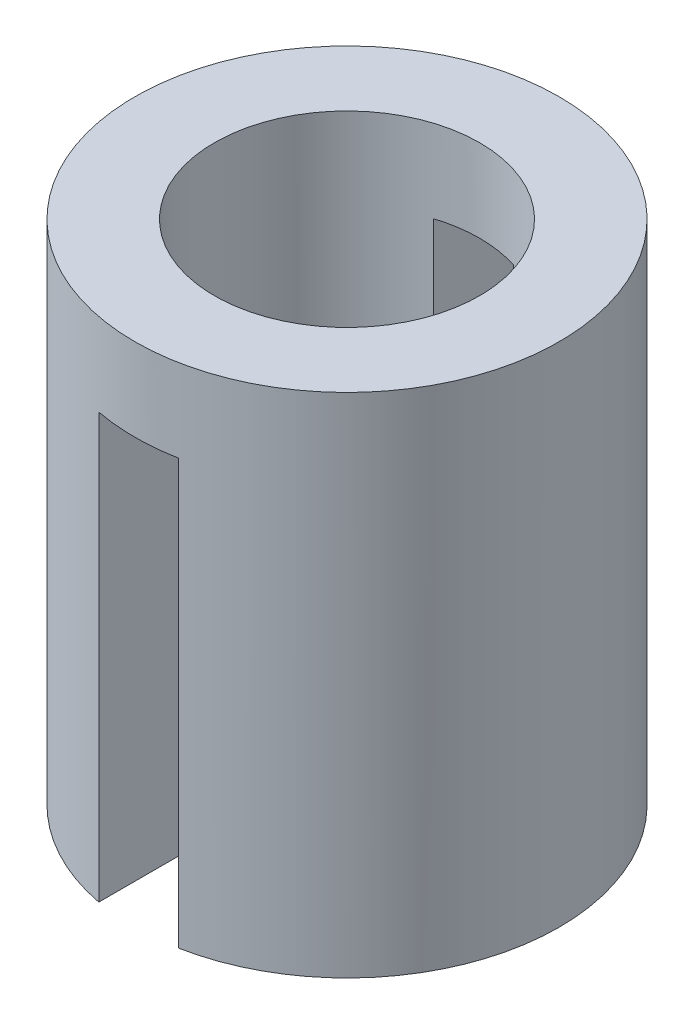
ISO-10303-21;
HEADER;
FILE_DESCRIPTION(('STEP AP214'),'2;1');
FILE_NAME('part.step','',(''),(''),'','','');
FILE_SCHEMA(('AUTOMOTIVE_DESIGN { 1 0 10303 214 1 1 1 1 }'));
ENDSEC;
DATA;
#1=APPLICATION_CONTEXT('core data for automotive mechanical design processes');
#2=APPLICATION_PROTOCOL_DEFINITION('international standard','automotive_design',2000,#1);
#3=PRODUCT_CONTEXT('',#1,'mechanical');
#4=PRODUCT('Part','Part','',(#3));
#5=PRODUCT_RELATED_PRODUCT_CATEGORY('part','',(#4));
#6=PRODUCT_DEFINITION_FORMATION('','',#4);
#7=PRODUCT_DEFINITION_CONTEXT('part definition',#1,'design');
#8=PRODUCT_DEFINITION('design','',#6,#7);
#9=PRODUCT_DEFINITION_SHAPE('','',#8);
#10=(LENGTH_UNIT() NAMED_UNIT(*) SI_UNIT(.MILLI.,.METRE.));
#11=(NAMED_UNIT(*) PLANE_ANGLE_UNIT() SI_UNIT($,.RADIAN.));
#12=(NAMED_UNIT(*) SI_UNIT($,.STERADIAN.) SOLID_ANGLE_UNIT());
#13=UNCERTAINTY_MEASURE_WITH_UNIT(LENGTH_MEASURE(1.E-05),#10,'distance_accuracy_value','');
#14=(GEOMETRIC_REPRESENTATION_CONTEXT(3) GLOBAL_UNCERTAINTY_ASSIGNED_CONTEXT((#13)) GLOBAL_UNIT_ASSIGNED_CONTEXT((#10,
#11,#12)) REPRESENTATION_CONTEXT('',''));
#15=CARTESIAN_POINT('',(0.,0.,0.));
#16=DIRECTION('',(0.,0.,1.));
#17=DIRECTION('',(1.,0.,0.));
#18=AXIS2_PLACEMENT_3D('',#15,#16,#17);
#19=CARTESIAN_POINT('',(2.,0.,0.));
#20=DIRECTION('',(0.,-1.,0.));
#21=DIRECTION('',(0.,0.,-1.));
#22=AXIS2_PLACEMENT_3D('',#19,#20,#21);
#23=PLANE('',#22);
#24=CARTESIAN_POINT('',(0.,0.,0.));
#25=DIRECTION('',(0.,-1.,0.));
#26=DIRECTION('',(0.,0.,-1.));
#27=AXIS2_PLACEMENT_3D('',#24,#25,#26);
#28=CIRCLE('',#27,2.);
#29=CARTESIAN_POINT('',(0.375,0.,-1.96452920568771));
#30=VERTEX_POINT('',#29);
#31=CARTESIAN_POINT('',(0.375,0.,1.96452920568771));
#32=VERTEX_POINT('',#31);
#33=EDGE_CURVE('E140',#30,#32,#28,.T.);
#34=ORIENTED_EDGE('',*,*,#33,.T.);
#35=DIRECTION('',(0.,0.,-1.));
#36=VECTOR('',#35,1.);
#37=CARTESIAN_POINT('',(0.375,0.,4.78));
#38=LINE('',#37,#36);
#39=CARTESIAN_POINT('',(0.375,0.,1.19242400177118));
#40=VERTEX_POINT('',#39);
#41=EDGE_CURVE('E169',#32,#40,#38,.T.);
#42=ORIENTED_EDGE('',*,*,#41,.T.);
#43=CARTESIAN_POINT('',(0.,0.,0.));
#44=DIRECTION('',(0.,-1.,0.));
#45=DIRECTION('',(0.,0.,-1.));
#46=AXIS2_PLACEMENT_3D('',#43,#44,#45);
#47=CIRCLE('',#46,1.25);
#48=CARTESIAN_POINT('',(0.375,0.,-1.19242400177118));
#49=VERTEX_POINT('',#48);
#50=EDGE_CURVE('E124',#49,#40,#47,.T.);
#51=ORIENTED_EDGE('',*,*,#50,.F.);
#52=EDGE_CURVE('E119',#49,#30,#38,.T.);
#53=ORIENTED_EDGE('',*,*,#52,.T.);
#54=EDGE_LOOP('',(#34,#42,#51,#53));
#55=FACE_BOUND('',#54,.T.);
#56=ADVANCED_FACE('F39',(#55),#23,.T.);
#57=CARTESIAN_POINT('',(0.,-55.,0.));
#58=DIRECTION('',(0.,-1.,0.));
#59=DIRECTION('',(0.,0.,-1.));
#60=AXIS2_PLACEMENT_3D('',#57,#58,#59);
#61=CYLINDRICAL_SURFACE('',#60,1.25);
#62=CARTESIAN_POINT('',(0.,4.78,0.));
#63=DIRECTION('',(0.,-1.,0.));
#64=DIRECTION('',(0.,0.,-1.));
#65=AXIS2_PLACEMENT_3D('',#62,#63,#64);
#66=CIRCLE('',#65,1.25);
#67=CARTESIAN_POINT('',(0.,4.78,-1.25));
#68=VERTEX_POINT('',#67);
#69=EDGE_CURVE('E141',#68,#68,#66,.T.);
#70=ORIENTED_EDGE('',*,*,#69,.F.);
#71=EDGE_LOOP('',(#70));
#72=FACE_BOUND('',#71,.T.);
#73=CARTESIAN_POINT('',(0.,4.,0.));
#74=DIRECTION('',(0.,-1.,0.));
#75=DIRECTION('',(0.,0.,-1.));
#76=AXIS2_PLACEMENT_3D('',#73,#74,#75);
#77=CIRCLE('',#76,1.25);
#78=CARTESIAN_POINT('',(0.375,4.,1.19242400177118));
#79=VERTEX_POINT('',#78);
#80=CARTESIAN_POINT('',(-0.375,4.,1.19242400177118));
#81=VERTEX_POINT('',#80);
#82=EDGE_CURVE('E103',#79,#81,#77,.T.);
#83=ORIENTED_EDGE('',*,*,#82,.T.);
#84=DIRECTION('',(0.,-1.,0.));
#85=VECTOR('',#84,1.);
#86=CARTESIAN_POINT('',(-0.375,-55.,1.19242400177118));
#87=LINE('',#86,#85);
#88=CARTESIAN_POINT('',(-0.375,0.,1.19242400177118));
#89=VERTEX_POINT('',#88);
#90=EDGE_CURVE('E131',#81,#89,#87,.T.);
#91=ORIENTED_EDGE('',*,*,#90,.T.);
#92=CARTESIAN_POINT('',(-0.375,0.,-1.19242400177118));
#93=VERTEX_POINT('',#92);
#94=EDGE_CURVE('E148',#89,#93,#47,.T.);
#95=ORIENTED_EDGE('',*,*,#94,.T.);
#96=DIRECTION('',(0.,-1.,0.));
#97=VECTOR('',#96,1.);
#98=CARTESIAN_POINT('',(-0.375,-55.,-1.19242400177118));
#99=LINE('',#98,#97);
#100=CARTESIAN_POINT('',(-0.375,4.,-1.19242400177118));
#101=VERTEX_POINT('',#100);
#102=EDGE_CURVE('E126',#93,#101,#99,.F.);
#103=ORIENTED_EDGE('',*,*,#102,.T.);
#104=CARTESIAN_POINT('',(0.375,4.,-1.19242400177118));
#105=VERTEX_POINT('',#104);
#106=EDGE_CURVE('E112',#101,#105,#77,.T.);
#107=ORIENTED_EDGE('',*,*,#106,.T.);
#108=DIRECTION('',(0.,-1.,0.));
#109=VECTOR('',#108,1.);
#110=CARTESIAN_POINT('',(0.375,-55.,-1.19242400177118));
#111=LINE('',#110,#109);
#112=EDGE_CURVE('E127',#105,#49,#111,.T.);
#113=ORIENTED_EDGE('',*,*,#112,.T.);
#114=ORIENTED_EDGE('',*,*,#50,.T.);
#115=DIRECTION('',(0.,-1.,0.));
#116=VECTOR('',#115,1.);
#117=CARTESIAN_POINT('',(0.375,-55.,1.19242400177118));
#118=LINE('',#117,#116);
#119=EDGE_CURVE('E109',#40,#79,#118,.F.);
#120=ORIENTED_EDGE('',*,*,#119,.T.);
#121=EDGE_LOOP('',(#83,#91,#95,#103,#107,#113,#114,#120));
#122=FACE_BOUND('',#121,.T.);
#123=ADVANCED_FACE('F125',(#72,#122),#61,.F.);
#124=CARTESIAN_POINT('',(0.,-55.,0.));
#125=DIRECTION('',(0.,-1.,0.));
#126=DIRECTION('',(0.,0.,-1.));
#127=AXIS2_PLACEMENT_3D('',#124,#125,#126);
#128=CYLINDRICAL_SURFACE('',#127,2.);
#129=CARTESIAN_POINT('',(0.,4.78,0.));
#130=DIRECTION('',(0.,-1.,0.));
#131=DIRECTION('',(0.,0.,-1.));
#132=AXIS2_PLACEMENT_3D('',#129,#130,#131);
#133=CIRCLE('',#132,2.);
#134=CARTESIAN_POINT('',(0.,4.78,-2.));
#135=VERTEX_POINT('',#134);
#136=EDGE_CURVE('E139',#135,#135,#133,.T.);
#137=ORIENTED_EDGE('',*,*,#136,.T.);
#138=EDGE_LOOP('',(#137));
#139=FACE_BOUND('',#138,.T.);
#140=CARTESIAN_POINT('',(-0.375,0.,1.96452920568771));
#141=VERTEX_POINT('',#140);
#142=CARTESIAN_POINT('',(-0.375,0.,-1.96452920568771));
#143=VERTEX_POINT('',#142);
#144=EDGE_CURVE('E136',#141,#143,#28,.T.);
#145=ORIENTED_EDGE('',*,*,#144,.F.);
#146=DIRECTION('',(0.,-1.,0.));
#147=VECTOR('',#146,1.);
#148=CARTESIAN_POINT('',(-0.375,-55.,1.96452920568771));
#149=LINE('',#148,#147);
#150=CARTESIAN_POINT('',(-0.375,4.,1.96452920568771));
#151=VERTEX_POINT('',#150);
#152=EDGE_CURVE('E11',#141,#151,#149,.F.);
#153=ORIENTED_EDGE('',*,*,#152,.T.);
#154=CARTESIAN_POINT('',(0.,4.,0.));
#155=DIRECTION('',(0.,-1.,0.));
#156=DIRECTION('',(0.,0.,-1.));
#157=AXIS2_PLACEMENT_3D('',#154,#155,#156);
#158=CIRCLE('',#157,2.);
#159=CARTESIAN_POINT('',(0.375,4.,1.96452920568771));
#160=VERTEX_POINT('',#159);
#161=EDGE_CURVE('E155',#151,#160,#158,.F.);
#162=ORIENTED_EDGE('',*,*,#161,.T.);
#163=DIRECTION('',(0.,-1.,0.));
#164=VECTOR('',#163,1.);
#165=CARTESIAN_POINT('',(0.375,-55.,1.96452920568771));
#166=LINE('',#165,#164);
#167=EDGE_CURVE('E50',#160,#32,#166,.T.);
#168=ORIENTED_EDGE('',*,*,#167,.T.);
#169=ORIENTED_EDGE('',*,*,#33,.F.);
#170=DIRECTION('',(0.,-1.,0.));
#171=VECTOR('',#170,1.);
#172=CARTESIAN_POINT('',(0.375,-55.,-1.96452920568771));
#173=LINE('',#172,#171);
#174=CARTESIAN_POINT('',(0.375,4.,-1.96452920568771));
#175=VERTEX_POINT('',#174);
#176=EDGE_CURVE('E151',#30,#175,#173,.F.);
#177=ORIENTED_EDGE('',*,*,#176,.T.);
#178=CARTESIAN_POINT('',(-0.375,4.,-1.96452920568771));
#179=VERTEX_POINT('',#178);
#180=EDGE_CURVE('E146',#175,#179,#158,.F.);
#181=ORIENTED_EDGE('',*,*,#180,.T.);
#182=DIRECTION('',(0.,-1.,0.));
#183=VECTOR('',#182,1.);
#184=CARTESIAN_POINT('',(-0.375,-55.,-1.96452920568771));
#185=LINE('',#184,#183);
#186=EDGE_CURVE('E154',#179,#143,#185,.T.);
#187=ORIENTED_EDGE('',*,*,#186,.T.);
#188=EDGE_LOOP('',(#145,#153,#162,#168,#169,#177,#181,#187));
#189=FACE_BOUND('',#188,.T.);
#190=ADVANCED_FACE('F159',(#139,#189),#128,.T.);
#191=DIRECTION('',(0.,0.,-1.));
#192=VECTOR('',#191,1.);
#193=CARTESIAN_POINT('',(-0.375,0.,4.78));
#194=LINE('',#193,#192);
#195=EDGE_CURVE('E168',#141,#89,#194,.T.);
#196=ORIENTED_EDGE('',*,*,#195,.F.);
#197=ORIENTED_EDGE('',*,*,#144,.T.);
#198=EDGE_CURVE('E166',#93,#143,#194,.T.);
#199=ORIENTED_EDGE('',*,*,#198,.F.);
#200=ORIENTED_EDGE('',*,*,#94,.F.);
#201=EDGE_LOOP('',(#196,#197,#199,#200));
#202=FACE_BOUND('',#201,.T.);
#203=ADVANCED_FACE('F41',(#202),#23,.T.);
#204=CARTESIAN_POINT('',(2.,4.78,0.));
#205=DIRECTION('',(0.,1.,0.));
#206=DIRECTION('',(0.,0.,1.));
#207=AXIS2_PLACEMENT_3D('',#204,#205,#206);
#208=PLANE('',#207);
#209=ORIENTED_EDGE('',*,*,#69,.T.);
#210=EDGE_LOOP('',(#209));
#211=FACE_BOUND('',#210,.T.);
#212=ORIENTED_EDGE('',*,*,#136,.F.);
#213=EDGE_LOOP('',(#212));
#214=FACE_BOUND('',#213,.T.);
#215=ADVANCED_FACE('F183',(#211,#214),#208,.T.);
#216=CARTESIAN_POINT('',(-0.375,4.,4.78));
#217=DIRECTION('',(0.,-1.,0.));
#218=DIRECTION('',(0.,0.,-1.));
#219=AXIS2_PLACEMENT_3D('',#216,#217,#218);
#220=PLANE('',#219);
#221=DIRECTION('',(0.,0.,-1.));
#222=VECTOR('',#221,1.);
#223=CARTESIAN_POINT('',(-0.375,4.,4.78));
#224=LINE('',#223,#222);
#225=EDGE_CURVE('E65',#101,#179,#224,.T.);
#226=ORIENTED_EDGE('',*,*,#225,.T.);
#227=ORIENTED_EDGE('',*,*,#180,.F.);
#228=DIRECTION('',(0.,0.,-1.));
#229=VECTOR('',#228,1.);
#230=CARTESIAN_POINT('',(0.375,4.,4.78));
#231=LINE('',#230,#229);
#232=EDGE_CURVE('E116',#105,#175,#231,.T.);
#233=ORIENTED_EDGE('',*,*,#232,.F.);
#234=ORIENTED_EDGE('',*,*,#106,.F.);
#235=EDGE_LOOP('',(#226,#227,#233,#234));
#236=FACE_BOUND('',#235,.T.);
#237=ADVANCED_FACE('F178',(#236),#220,.T.);
#238=CARTESIAN_POINT('',(0.375,0.,4.78));
#239=DIRECTION('',(-1.,0.,0.));
#240=DIRECTION('',(0.,0.,1.));
#241=AXIS2_PLACEMENT_3D('',#238,#239,#240);
#242=PLANE('',#241);
#243=ORIENTED_EDGE('',*,*,#232,.T.);
#244=ORIENTED_EDGE('',*,*,#176,.F.);
#245=ORIENTED_EDGE('',*,*,#52,.F.);
#246=ORIENTED_EDGE('',*,*,#112,.F.);
#247=EDGE_LOOP('',(#243,#244,#245,#246));
#248=FACE_BOUND('',#247,.T.);
#249=ADVANCED_FACE('F173',(#248),#242,.T.);
#250=CARTESIAN_POINT('',(-0.375,0.,4.78));
#251=DIRECTION('',(1.,0.,0.));
#252=DIRECTION('',(0.,0.,-1.));
#253=AXIS2_PLACEMENT_3D('',#250,#251,#252);
#254=PLANE('',#253);
#255=ORIENTED_EDGE('',*,*,#198,.T.);
#256=ORIENTED_EDGE('',*,*,#186,.F.);
#257=ORIENTED_EDGE('',*,*,#225,.F.);
#258=ORIENTED_EDGE('',*,*,#102,.F.);
#259=EDGE_LOOP('',(#255,#256,#257,#258));
#260=FACE_BOUND('',#259,.T.);
#261=ADVANCED_FACE('F182',(#260),#254,.T.);
#262=EDGE_CURVE('E106',#151,#81,#224,.T.);
#263=ORIENTED_EDGE('',*,*,#262,.F.);
#264=ORIENTED_EDGE('',*,*,#152,.F.);
#265=ORIENTED_EDGE('',*,*,#195,.T.);
#266=ORIENTED_EDGE('',*,*,#90,.F.);
#267=EDGE_LOOP('',(#263,#264,#265,#266));
#268=FACE_BOUND('',#267,.T.);
#269=ADVANCED_FACE('F165',(#268),#254,.T.);
#270=EDGE_CURVE('E53',#160,#79,#231,.T.);
#271=ORIENTED_EDGE('',*,*,#270,.F.);
#272=ORIENTED_EDGE('',*,*,#161,.F.);
#273=ORIENTED_EDGE('',*,*,#262,.T.);
#274=ORIENTED_EDGE('',*,*,#82,.F.);
#275=EDGE_LOOP('',(#271,#272,#273,#274));
#276=FACE_BOUND('',#275,.T.);
#277=ADVANCED_FACE('F102',(#276),#220,.T.);
#278=ORIENTED_EDGE('',*,*,#41,.F.);
#279=ORIENTED_EDGE('',*,*,#167,.F.);
#280=ORIENTED_EDGE('',*,*,#270,.T.);
#281=ORIENTED_EDGE('',*,*,#119,.F.);
#282=EDGE_LOOP('',(#278,#279,#280,#281));
#283=FACE_BOUND('',#282,.T.);
#284=ADVANCED_FACE('F111',(#283),#242,.T.);
#285=CLOSED_SHELL('',(#56,#123,#190,#203,#215,#237,#249,#261,#269,#277,#284));
#286=MANIFOLD_SOLID_BREP('B2',#285);
#287=ADVANCED_BREP_SHAPE_REPRESENTATION('',(#18,#286),#14);
#288=SHAPE_DEFINITION_REPRESENTATION(#9,#287);
ENDSEC;
END-ISO-10303-21;
